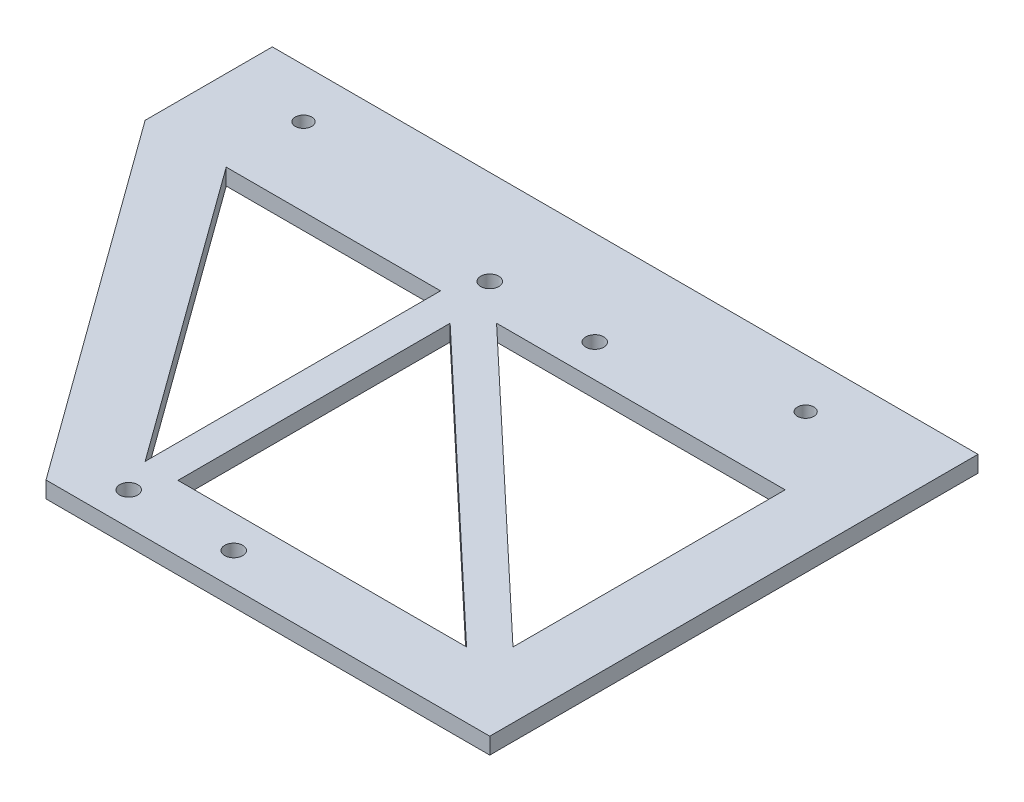
ISO-10303-21;
HEADER;
FILE_DESCRIPTION(('STEP AP214'),'2;1');
FILE_NAME('part.step','',(''),(''),'','','');
FILE_SCHEMA(('AUTOMOTIVE_DESIGN { 1 0 10303 214 1 1 1 1 }'));
ENDSEC;
DATA;
#1=APPLICATION_CONTEXT('core data for automotive mechanical design processes');
#2=APPLICATION_PROTOCOL_DEFINITION('international standard','automotive_design',2000,#1);
#3=PRODUCT_CONTEXT('',#1,'mechanical');
#4=PRODUCT('Part','Part','',(#3));
#5=PRODUCT_RELATED_PRODUCT_CATEGORY('part','',(#4));
#6=PRODUCT_DEFINITION_FORMATION('','',#4);
#7=PRODUCT_DEFINITION_CONTEXT('part definition',#1,'design');
#8=PRODUCT_DEFINITION('design','',#6,#7);
#9=PRODUCT_DEFINITION_SHAPE('','',#8);
#10=(LENGTH_UNIT() NAMED_UNIT(*) SI_UNIT(.MILLI.,.METRE.));
#11=(NAMED_UNIT(*) PLANE_ANGLE_UNIT() SI_UNIT($,.RADIAN.));
#12=(NAMED_UNIT(*) SI_UNIT($,.STERADIAN.) SOLID_ANGLE_UNIT());
#13=UNCERTAINTY_MEASURE_WITH_UNIT(LENGTH_MEASURE(1.E-05),#10,'distance_accuracy_value','');
#14=(GEOMETRIC_REPRESENTATION_CONTEXT(3) GLOBAL_UNCERTAINTY_ASSIGNED_CONTEXT((#13)) GLOBAL_UNIT_ASSIGNED_CONTEXT((#10,
#11,#12)) REPRESENTATION_CONTEXT('',''));
#15=CARTESIAN_POINT('',(0.,0.,0.));
#16=DIRECTION('',(0.,0.,1.));
#17=DIRECTION('',(1.,0.,0.));
#18=AXIS2_PLACEMENT_3D('',#15,#16,#17);
#19=CARTESIAN_POINT('',(0.,5.,0.));
#20=DIRECTION('',(0.,-1.,0.));
#21=DIRECTION('',(0.,0.,-1.));
#22=AXIS2_PLACEMENT_3D('',#19,#20,#21);
#23=PLANE('',#22);
#24=CARTESIAN_POINT('',(97.6994431142104,5.,-133.75));
#25=DIRECTION('',(0.,1.,0.));
#26=DIRECTION('',(0.,0.,1.));
#27=AXIS2_PLACEMENT_3D('',#24,#25,#26);
#28=CIRCLE('',#27,2.50000000000001);
#29=CARTESIAN_POINT('',(97.6994431142104,5.,-131.25));
#30=VERTEX_POINT('',#29);
#31=EDGE_CURVE('E183',#30,#30,#28,.T.);
#32=ORIENTED_EDGE('',*,*,#31,.F.);
#33=EDGE_LOOP('',(#32));
#34=FACE_BOUND('',#33,.T.);
#35=DIRECTION('',(0.,0.,1.));
#36=VECTOR('',#35,1.);
#37=CARTESIAN_POINT('',(20.1994431142178,5.,-20.));
#38=LINE('',#37,#36);
#39=CARTESIAN_POINT('',(20.1994431142178,5.,-102.925904836341));
#40=VERTEX_POINT('',#39);
#41=CARTESIAN_POINT('',(20.1994431142178,5.,-20.));
#42=VERTEX_POINT('',#41);
#43=EDGE_CURVE('E191',#40,#42,#38,.T.);
#44=ORIENTED_EDGE('',*,*,#43,.F.);
#45=DIRECTION('',(-0.727488889904011,0.,-0.686119461221025));
#46=VECTOR('',#45,1.);
#47=CARTESIAN_POINT('',(20.1994431142178,5.,-102.925904836341));
#48=LINE('',#47,#46);
#49=CARTESIAN_POINT('',(108.12534795055,5.,-20.));
#50=VERTEX_POINT('',#49);
#51=EDGE_CURVE('E199',#50,#40,#48,.T.);
#52=ORIENTED_EDGE('',*,*,#51,.F.);
#53=DIRECTION('',(1.,0.,0.));
#54=VECTOR('',#53,1.);
#55=CARTESIAN_POINT('',(108.12534795055,5.,-20.));
#56=LINE('',#55,#54);
#57=EDGE_CURVE('E194',#42,#50,#56,.T.);
#58=ORIENTED_EDGE('',*,*,#57,.F.);
#59=EDGE_LOOP('',(#44,#52,#58));
#60=FACE_BOUND('',#59,.T.);
#61=CARTESIAN_POINT('',(47.1994431142081,5.,-120.));
#62=DIRECTION('',(0.,1.,0.));
#63=DIRECTION('',(0.,0.,1.));
#64=AXIS2_PLACEMENT_3D('',#61,#62,#63);
#65=CIRCLE('',#64,2.75000000000001);
#66=CARTESIAN_POINT('',(47.1994431142081,5.,-117.25));
#67=VERTEX_POINT('',#66);
#68=EDGE_CURVE('E257',#67,#67,#65,.T.);
#69=ORIENTED_EDGE('',*,*,#68,.F.);
#70=EDGE_LOOP('',(#69));
#71=FACE_BOUND('',#70,.T.);
#72=CARTESIAN_POINT('',(15.1994431142081,5.,-120.));
#73=DIRECTION('',(0.,1.,0.));
#74=DIRECTION('',(0.,0.,1.));
#75=AXIS2_PLACEMENT_3D('',#72,#73,#74);
#76=CIRCLE('',#75,2.75);
#77=CARTESIAN_POINT('',(15.1994431142081,5.,-117.25));
#78=VERTEX_POINT('',#77);
#79=EDGE_CURVE('E265',#78,#78,#76,.T.);
#80=ORIENTED_EDGE('',*,*,#79,.F.);
#81=EDGE_LOOP('',(#80));
#82=FACE_BOUND('',#81,.T.);
#83=CARTESIAN_POINT('',(47.199443114208,5.,-10.));
#84=DIRECTION('',(0.,1.,0.));
#85=DIRECTION('',(0.,0.,1.));
#86=AXIS2_PLACEMENT_3D('',#83,#84,#85);
#87=CIRCLE('',#86,2.75000000000001);
#88=CARTESIAN_POINT('',(47.199443114208,5.,-7.25000000000003));
#89=VERTEX_POINT('',#88);
#90=EDGE_CURVE('E273',#89,#89,#87,.T.);
#91=ORIENTED_EDGE('',*,*,#90,.F.);
#92=EDGE_LOOP('',(#91));
#93=FACE_BOUND('',#92,.T.);
#94=CARTESIAN_POINT('',(15.199443114208,5.,-10.));
#95=DIRECTION('',(0.,1.,0.));
#96=DIRECTION('',(0.,0.,1.));
#97=AXIS2_PLACEMENT_3D('',#94,#95,#96);
#98=CIRCLE('',#97,2.75);
#99=CARTESIAN_POINT('',(15.199443114208,5.,-7.25000000000004));
#100=VERTEX_POINT('',#99);
#101=EDGE_CURVE('E281',#100,#100,#98,.T.);
#102=ORIENTED_EDGE('',*,*,#101,.F.);
#103=EDGE_LOOP('',(#102));
#104=FACE_BOUND('',#103,.T.);
#105=CARTESIAN_POINT('',(-55.3005568857919,5.,-133.75));
#106=DIRECTION('',(0.,1.,0.));
#107=DIRECTION('',(0.,0.,1.));
#108=AXIS2_PLACEMENT_3D('',#105,#106,#107);
#109=CIRCLE('',#108,2.50000000000004);
#110=CARTESIAN_POINT('',(-55.3005568857919,5.,-131.25));
#111=VERTEX_POINT('',#110);
#112=EDGE_CURVE('E289',#111,#111,#109,.T.);
#113=ORIENTED_EDGE('',*,*,#112,.F.);
#114=EDGE_LOOP('',(#113));
#115=FACE_BOUND('',#114,.T.);
#116=DIRECTION('',(0.58721139388764,0.,0.809433616109768));
#117=VECTOR('',#116,1.);
#118=CARTESIAN_POINT('',(-79.8005568857919,5.,-109.999999999999));
#119=LINE('',#118,#117);
#120=CARTESIAN_POINT('',(-79.8005568857919,5.,-109.999999999999));
#121=VERTEX_POINT('',#120);
#122=CARTESIAN_POINT('',(0.,5.,0.));
#123=VERTEX_POINT('',#122);
#124=EDGE_CURVE('E297',#121,#123,#119,.T.);
#125=ORIENTED_EDGE('',*,*,#124,.T.);
#126=DIRECTION('',(1.,0.,0.));
#127=VECTOR('',#126,1.);
#128=CARTESIAN_POINT('',(135.199443114208,5.,0.));
#129=LINE('',#128,#127);
#130=CARTESIAN_POINT('',(135.199443114208,5.,0.));
#131=VERTEX_POINT('',#130);
#132=EDGE_CURVE('E301',#123,#131,#129,.T.);
#133=ORIENTED_EDGE('',*,*,#132,.T.);
#134=DIRECTION('',(0.,0.,-1.));
#135=VECTOR('',#134,1.);
#136=CARTESIAN_POINT('',(135.199443114208,5.,0.));
#137=LINE('',#136,#135);
#138=CARTESIAN_POINT('',(135.199443114208,5.,-148.75));
#139=VERTEX_POINT('',#138);
#140=EDGE_CURVE('E305',#131,#139,#137,.T.);
#141=ORIENTED_EDGE('',*,*,#140,.T.);
#142=DIRECTION('',(-1.,0.,0.));
#143=VECTOR('',#142,1.);
#144=CARTESIAN_POINT('',(-79.8005568857919,5.,-148.75));
#145=LINE('',#144,#143);
#146=CARTESIAN_POINT('',(-79.8005568857919,5.,-148.75));
#147=VERTEX_POINT('',#146);
#148=EDGE_CURVE('E308',#139,#147,#145,.T.);
#149=ORIENTED_EDGE('',*,*,#148,.T.);
#150=DIRECTION('',(0.,0.,1.));
#151=VECTOR('',#150,1.);
#152=CARTESIAN_POINT('',(-79.8005568857919,5.,-109.999999999999));
#153=LINE('',#152,#151);
#154=EDGE_CURVE('E311',#147,#121,#153,.T.);
#155=ORIENTED_EDGE('',*,*,#154,.T.);
#156=EDGE_LOOP('',(#125,#133,#141,#149,#155));
#157=FACE_BOUND('',#156,.T.);
#158=DIRECTION('',(0.,0.,-1.));
#159=VECTOR('',#158,1.);
#160=CARTESIAN_POINT('',(115.199443114208,5.,-109.999999999999));
#161=LINE('',#160,#159);
#162=CARTESIAN_POINT('',(115.199443114208,5.,-27.0740951636579));
#163=VERTEX_POINT('',#162);
#164=CARTESIAN_POINT('',(115.199443114208,5.,-109.999999999999));
#165=VERTEX_POINT('',#164);
#166=EDGE_CURVE('E224',#163,#165,#161,.T.);
#167=ORIENTED_EDGE('',*,*,#166,.F.);
#168=DIRECTION('',(0.727488889904011,0.,0.686119461221025));
#169=VECTOR('',#168,1.);
#170=CARTESIAN_POINT('',(27.2735382778757,5.,-109.999999999999));
#171=LINE('',#170,#169);
#172=CARTESIAN_POINT('',(27.2735382778757,5.,-109.999999999999));
#173=VERTEX_POINT('',#172);
#174=EDGE_CURVE('E232',#173,#163,#171,.T.);
#175=ORIENTED_EDGE('',*,*,#174,.F.);
#176=DIRECTION('',(-1.,0.,0.));
#177=VECTOR('',#176,1.);
#178=CARTESIAN_POINT('',(27.2735382778757,5.,-109.999999999999));
#179=LINE('',#178,#177);
#180=EDGE_CURVE('E227',#165,#173,#179,.T.);
#181=ORIENTED_EDGE('',*,*,#180,.F.);
#182=EDGE_LOOP('',(#167,#175,#181));
#183=FACE_BOUND('',#182,.T.);
#184=DIRECTION('',(-1.,0.,0.));
#185=VECTOR('',#184,1.);
#186=CARTESIAN_POINT('',(-55.0919216105209,5.,-109.999999999999));
#187=LINE('',#186,#185);
#188=CARTESIAN_POINT('',(10.1994431142178,5.,-109.999999999999));
#189=VERTEX_POINT('',#188);
#190=CARTESIAN_POINT('',(-55.0919216105209,5.,-109.999999999999));
#191=VERTEX_POINT('',#190);
#192=EDGE_CURVE('E147',#189,#191,#187,.T.);
#193=ORIENTED_EDGE('',*,*,#192,.F.);
#194=DIRECTION('',(0.,0.,-1.));
#195=VECTOR('',#194,1.);
#196=CARTESIAN_POINT('',(10.1994431142178,5.,-109.999999999999));
#197=LINE('',#196,#195);
#198=CARTESIAN_POINT('',(10.1994431142178,5.,-20.));
#199=VERTEX_POINT('',#198);
#200=EDGE_CURVE('E166',#199,#189,#197,.T.);
#201=ORIENTED_EDGE('',*,*,#200,.F.);
#202=DIRECTION('',(0.58721139388764,0.,0.809433616109768));
#203=VECTOR('',#202,1.);
#204=CARTESIAN_POINT('',(-55.0919216105209,5.,-109.999999999999));
#205=LINE('',#204,#203);
#206=EDGE_CURVE('E156',#191,#199,#205,.T.);
#207=ORIENTED_EDGE('',*,*,#206,.F.);
#208=EDGE_LOOP('',(#193,#201,#207));
#209=FACE_BOUND('',#208,.T.);
#210=ADVANCED_FACE('F45',(#34,#60,#71,#82,#93,#104,#115,#157,#183,#209),#23,.F.);
#211=CARTESIAN_POINT('',(0.,0.,0.));
#212=DIRECTION('',(0.,-1.,0.));
#213=DIRECTION('',(0.,0.,-1.));
#214=AXIS2_PLACEMENT_3D('',#211,#212,#213);
#215=PLANE('',#214);
#216=DIRECTION('',(-0.727488889904011,0.,-0.686119461221025));
#217=VECTOR('',#216,1.);
#218=CARTESIAN_POINT('',(20.1994431142178,0.,-102.925904836341));
#219=LINE('',#218,#217);
#220=CARTESIAN_POINT('',(108.12534795055,0.,-20.));
#221=VERTEX_POINT('',#220);
#222=CARTESIAN_POINT('',(20.1994431142178,0.,-102.925904836341));
#223=VERTEX_POINT('',#222);
#224=EDGE_CURVE('E195',#221,#223,#219,.T.);
#225=ORIENTED_EDGE('',*,*,#224,.T.);
#226=DIRECTION('',(0.,0.,1.));
#227=VECTOR('',#226,1.);
#228=CARTESIAN_POINT('',(20.1994431142178,0.,-20.));
#229=LINE('',#228,#227);
#230=CARTESIAN_POINT('',(20.1994431142178,0.,-20.));
#231=VERTEX_POINT('',#230);
#232=EDGE_CURVE('E187',#223,#231,#229,.T.);
#233=ORIENTED_EDGE('',*,*,#232,.T.);
#234=DIRECTION('',(1.,0.,0.));
#235=VECTOR('',#234,1.);
#236=CARTESIAN_POINT('',(108.12534795055,0.,-20.));
#237=LINE('',#236,#235);
#238=EDGE_CURVE('E206',#231,#221,#237,.T.);
#239=ORIENTED_EDGE('',*,*,#238,.T.);
#240=EDGE_LOOP('',(#225,#233,#239));
#241=FACE_BOUND('',#240,.T.);
#242=DIRECTION('',(0.727488889904011,0.,0.686119461221025));
#243=VECTOR('',#242,1.);
#244=CARTESIAN_POINT('',(27.2735382778757,0.,-109.999999999999));
#245=LINE('',#244,#243);
#246=CARTESIAN_POINT('',(27.2735382778757,0.,-109.999999999999));
#247=VERTEX_POINT('',#246);
#248=CARTESIAN_POINT('',(115.199443114208,0.,-27.0740951636579));
#249=VERTEX_POINT('',#248);
#250=EDGE_CURVE('E228',#247,#249,#245,.T.);
#251=ORIENTED_EDGE('',*,*,#250,.T.);
#252=DIRECTION('',(0.,0.,-1.));
#253=VECTOR('',#252,1.);
#254=CARTESIAN_POINT('',(115.199443114208,0.,-109.999999999999));
#255=LINE('',#254,#253);
#256=CARTESIAN_POINT('',(115.199443114208,0.,-109.999999999999));
#257=VERTEX_POINT('',#256);
#258=EDGE_CURVE('E223',#249,#257,#255,.T.);
#259=ORIENTED_EDGE('',*,*,#258,.T.);
#260=DIRECTION('',(-1.,0.,0.));
#261=VECTOR('',#260,1.);
#262=CARTESIAN_POINT('',(27.2735382778757,0.,-109.999999999999));
#263=LINE('',#262,#261);
#264=EDGE_CURVE('E239',#257,#247,#263,.T.);
#265=ORIENTED_EDGE('',*,*,#264,.T.);
#266=EDGE_LOOP('',(#251,#259,#265));
#267=FACE_BOUND('',#266,.T.);
#268=CARTESIAN_POINT('',(47.1994431142081,0.,-120.));
#269=DIRECTION('',(0.,1.,0.));
#270=DIRECTION('',(0.,0.,1.));
#271=AXIS2_PLACEMENT_3D('',#268,#269,#270);
#272=CIRCLE('',#271,2.75000000000001);
#273=CARTESIAN_POINT('',(47.1994431142081,0.,-117.25));
#274=VERTEX_POINT('',#273);
#275=EDGE_CURVE('E256',#274,#274,#272,.T.);
#276=ORIENTED_EDGE('',*,*,#275,.T.);
#277=EDGE_LOOP('',(#276));
#278=FACE_BOUND('',#277,.T.);
#279=CARTESIAN_POINT('',(47.199443114208,0.,-10.));
#280=DIRECTION('',(0.,1.,0.));
#281=DIRECTION('',(0.,0.,1.));
#282=AXIS2_PLACEMENT_3D('',#279,#280,#281);
#283=CIRCLE('',#282,2.75000000000001);
#284=CARTESIAN_POINT('',(47.199443114208,0.,-7.25000000000003));
#285=VERTEX_POINT('',#284);
#286=EDGE_CURVE('E269',#285,#285,#283,.T.);
#287=ORIENTED_EDGE('',*,*,#286,.T.);
#288=EDGE_LOOP('',(#287));
#289=FACE_BOUND('',#288,.T.);
#290=CARTESIAN_POINT('',(-55.3005568857919,0.,-133.75));
#291=DIRECTION('',(0.,1.,0.));
#292=DIRECTION('',(0.,0.,1.));
#293=AXIS2_PLACEMENT_3D('',#290,#291,#292);
#294=CIRCLE('',#293,2.50000000000004);
#295=CARTESIAN_POINT('',(-55.3005568857919,0.,-131.25));
#296=VERTEX_POINT('',#295);
#297=EDGE_CURVE('E285',#296,#296,#294,.T.);
#298=ORIENTED_EDGE('',*,*,#297,.T.);
#299=EDGE_LOOP('',(#298));
#300=FACE_BOUND('',#299,.T.);
#301=DIRECTION('',(0.58721139388764,0.,0.809433616109768));
#302=VECTOR('',#301,1.);
#303=CARTESIAN_POINT('',(-79.8005568857919,0.,-109.999999999999));
#304=LINE('',#303,#302);
#305=CARTESIAN_POINT('',(-79.8005568857919,0.,-109.999999999999));
#306=VERTEX_POINT('',#305);
#307=CARTESIAN_POINT('',(0.,0.,0.));
#308=VERTEX_POINT('',#307);
#309=EDGE_CURVE('E293',#306,#308,#304,.T.);
#310=ORIENTED_EDGE('',*,*,#309,.F.);
#311=DIRECTION('',(0.,0.,1.));
#312=VECTOR('',#311,1.);
#313=CARTESIAN_POINT('',(-79.8005568857919,0.,-109.999999999999));
#314=LINE('',#313,#312);
#315=CARTESIAN_POINT('',(-79.8005568857919,0.,-148.75));
#316=VERTEX_POINT('',#315);
#317=EDGE_CURVE('E302',#316,#306,#314,.T.);
#318=ORIENTED_EDGE('',*,*,#317,.F.);
#319=DIRECTION('',(-1.,0.,0.));
#320=VECTOR('',#319,1.);
#321=CARTESIAN_POINT('',(-79.8005568857919,0.,-148.75));
#322=LINE('',#321,#320);
#323=CARTESIAN_POINT('',(135.199443114208,0.,-148.75));
#324=VERTEX_POINT('',#323);
#325=EDGE_CURVE('E324',#324,#316,#322,.T.);
#326=ORIENTED_EDGE('',*,*,#325,.F.);
#327=DIRECTION('',(0.,0.,-1.));
#328=VECTOR('',#327,1.);
#329=CARTESIAN_POINT('',(135.199443114208,0.,0.));
#330=LINE('',#329,#328);
#331=CARTESIAN_POINT('',(135.199443114208,0.,0.));
#332=VERTEX_POINT('',#331);
#333=EDGE_CURVE('E321',#332,#324,#330,.T.);
#334=ORIENTED_EDGE('',*,*,#333,.F.);
#335=DIRECTION('',(1.,0.,0.));
#336=VECTOR('',#335,1.);
#337=CARTESIAN_POINT('',(135.199443114208,0.,0.));
#338=LINE('',#337,#336);
#339=EDGE_CURVE('E318',#308,#332,#338,.T.);
#340=ORIENTED_EDGE('',*,*,#339,.F.);
#341=EDGE_LOOP('',(#310,#318,#326,#334,#340));
#342=FACE_BOUND('',#341,.T.);
#343=CARTESIAN_POINT('',(15.199443114208,0.,-10.));
#344=DIRECTION('',(0.,1.,0.));
#345=DIRECTION('',(0.,0.,1.));
#346=AXIS2_PLACEMENT_3D('',#343,#344,#345);
#347=CIRCLE('',#346,2.75);
#348=CARTESIAN_POINT('',(15.199443114208,0.,-7.25000000000004));
#349=VERTEX_POINT('',#348);
#350=EDGE_CURVE('E277',#349,#349,#347,.T.);
#351=ORIENTED_EDGE('',*,*,#350,.T.);
#352=EDGE_LOOP('',(#351));
#353=FACE_BOUND('',#352,.T.);
#354=CARTESIAN_POINT('',(15.1994431142081,0.,-120.));
#355=DIRECTION('',(0.,1.,0.));
#356=DIRECTION('',(0.,0.,1.));
#357=AXIS2_PLACEMENT_3D('',#354,#355,#356);
#358=CIRCLE('',#357,2.75);
#359=CARTESIAN_POINT('',(15.1994431142081,0.,-117.25));
#360=VERTEX_POINT('',#359);
#361=EDGE_CURVE('E261',#360,#360,#358,.T.);
#362=ORIENTED_EDGE('',*,*,#361,.T.);
#363=EDGE_LOOP('',(#362));
#364=FACE_BOUND('',#363,.T.);
#365=CARTESIAN_POINT('',(97.6994431142104,0.,-133.75));
#366=DIRECTION('',(0.,1.,0.));
#367=DIRECTION('',(0.,0.,1.));
#368=AXIS2_PLACEMENT_3D('',#365,#366,#367);
#369=CIRCLE('',#368,2.50000000000001);
#370=CARTESIAN_POINT('',(97.6994431142104,0.,-131.25));
#371=VERTEX_POINT('',#370);
#372=EDGE_CURVE('E164',#371,#371,#369,.T.);
#373=ORIENTED_EDGE('',*,*,#372,.T.);
#374=EDGE_LOOP('',(#373));
#375=FACE_BOUND('',#374,.T.);
#376=DIRECTION('',(0.,0.,-1.));
#377=VECTOR('',#376,1.);
#378=CARTESIAN_POINT('',(10.1994431142178,0.,-109.999999999999));
#379=LINE('',#378,#377);
#380=CARTESIAN_POINT('',(10.1994431142178,0.,-20.));
#381=VERTEX_POINT('',#380);
#382=CARTESIAN_POINT('',(10.1994431142178,0.,-109.999999999999));
#383=VERTEX_POINT('',#382);
#384=EDGE_CURVE('E157',#381,#383,#379,.T.);
#385=ORIENTED_EDGE('',*,*,#384,.T.);
#386=DIRECTION('',(-1.,0.,0.));
#387=VECTOR('',#386,1.);
#388=CARTESIAN_POINT('',(-55.0919216105209,0.,-109.999999999999));
#389=LINE('',#388,#387);
#390=CARTESIAN_POINT('',(-55.0919216105209,0.,-109.999999999999));
#391=VERTEX_POINT('',#390);
#392=EDGE_CURVE('E69',#383,#391,#389,.T.);
#393=ORIENTED_EDGE('',*,*,#392,.T.);
#394=DIRECTION('',(0.58721139388764,0.,0.809433616109768));
#395=VECTOR('',#394,1.);
#396=CARTESIAN_POINT('',(-55.0919216105209,0.,-109.999999999999));
#397=LINE('',#396,#395);
#398=EDGE_CURVE('E162',#391,#381,#397,.T.);
#399=ORIENTED_EDGE('',*,*,#398,.T.);
#400=EDGE_LOOP('',(#385,#393,#399));
#401=FACE_BOUND('',#400,.T.);
#402=ADVANCED_FACE('F351',(#241,#267,#278,#289,#300,#342,#353,#364,#375,#401),#215,.T.);
#403=CARTESIAN_POINT('',(-79.8005568857919,5.,-109.999999999999));
#404=DIRECTION('',(0.809433616109768,0.,-0.58721139388764));
#405=DIRECTION('',(-0.58721139388764,0.,-0.809433616109768));
#406=AXIS2_PLACEMENT_3D('',#403,#404,#405);
#407=PLANE('',#406);
#408=ORIENTED_EDGE('',*,*,#309,.T.);
#409=DIRECTION('',(0.,-1.,0.));
#410=VECTOR('',#409,1.);
#411=CARTESIAN_POINT('',(0.,5.,0.));
#412=LINE('',#411,#410);
#413=EDGE_CURVE('E11',#123,#308,#412,.T.);
#414=ORIENTED_EDGE('',*,*,#413,.F.);
#415=ORIENTED_EDGE('',*,*,#124,.F.);
#416=DIRECTION('',(0.,-1.,0.));
#417=VECTOR('',#416,1.);
#418=CARTESIAN_POINT('',(-79.8005568857919,5.,-109.999999999999));
#419=LINE('',#418,#417);
#420=EDGE_CURVE('E314',#121,#306,#419,.T.);
#421=ORIENTED_EDGE('',*,*,#420,.T.);
#422=EDGE_LOOP('',(#408,#414,#415,#421));
#423=FACE_BOUND('',#422,.T.);
#424=ADVANCED_FACE('F47',(#423),#407,.F.);
#425=CARTESIAN_POINT('',(135.199443114208,5.,0.));
#426=DIRECTION('',(0.,0.,-1.));
#427=DIRECTION('',(-1.,0.,0.));
#428=AXIS2_PLACEMENT_3D('',#425,#426,#427);
#429=PLANE('',#428);
#430=ORIENTED_EDGE('',*,*,#339,.T.);
#431=DIRECTION('',(0.,-1.,0.));
#432=VECTOR('',#431,1.);
#433=CARTESIAN_POINT('',(135.199443114208,5.,0.));
#434=LINE('',#433,#432);
#435=EDGE_CURVE('E54',#131,#332,#434,.T.);
#436=ORIENTED_EDGE('',*,*,#435,.F.);
#437=ORIENTED_EDGE('',*,*,#132,.F.);
#438=ORIENTED_EDGE('',*,*,#413,.T.);
#439=EDGE_LOOP('',(#430,#436,#437,#438));
#440=FACE_BOUND('',#439,.T.);
#441=ADVANCED_FACE('F366',(#440),#429,.F.);
#442=CARTESIAN_POINT('',(135.199443114208,5.,0.));
#443=DIRECTION('',(-1.,0.,0.));
#444=DIRECTION('',(0.,0.,1.));
#445=AXIS2_PLACEMENT_3D('',#442,#443,#444);
#446=PLANE('',#445);
#447=ORIENTED_EDGE('',*,*,#333,.T.);
#448=DIRECTION('',(0.,-1.,0.));
#449=VECTOR('',#448,1.);
#450=CARTESIAN_POINT('',(135.199443114208,5.,-148.75));
#451=LINE('',#450,#449);
#452=EDGE_CURVE('E336',#139,#324,#451,.T.);
#453=ORIENTED_EDGE('',*,*,#452,.F.);
#454=ORIENTED_EDGE('',*,*,#140,.F.);
#455=ORIENTED_EDGE('',*,*,#435,.T.);
#456=EDGE_LOOP('',(#447,#453,#454,#455));
#457=FACE_BOUND('',#456,.T.);
#458=ADVANCED_FACE('F345',(#457),#446,.F.);
#459=CARTESIAN_POINT('',(-79.8005568857919,5.,-148.75));
#460=DIRECTION('',(0.,0.,1.));
#461=DIRECTION('',(1.,0.,0.));
#462=AXIS2_PLACEMENT_3D('',#459,#460,#461);
#463=PLANE('',#462);
#464=ORIENTED_EDGE('',*,*,#325,.T.);
#465=DIRECTION('',(0.,-1.,0.));
#466=VECTOR('',#465,1.);
#467=CARTESIAN_POINT('',(-79.8005568857919,5.,-148.75));
#468=LINE('',#467,#466);
#469=EDGE_CURVE('E332',#147,#316,#468,.T.);
#470=ORIENTED_EDGE('',*,*,#469,.F.);
#471=ORIENTED_EDGE('',*,*,#148,.F.);
#472=ORIENTED_EDGE('',*,*,#452,.T.);
#473=EDGE_LOOP('',(#464,#470,#471,#472));
#474=FACE_BOUND('',#473,.T.);
#475=ADVANCED_FACE('F356',(#474),#463,.F.);
#476=CARTESIAN_POINT('',(-79.8005568857919,5.,-109.999999999999));
#477=DIRECTION('',(1.,0.,0.));
#478=DIRECTION('',(0.,0.,-1.));
#479=AXIS2_PLACEMENT_3D('',#476,#477,#478);
#480=PLANE('',#479);
#481=ORIENTED_EDGE('',*,*,#317,.T.);
#482=ORIENTED_EDGE('',*,*,#420,.F.);
#483=ORIENTED_EDGE('',*,*,#154,.F.);
#484=ORIENTED_EDGE('',*,*,#469,.T.);
#485=EDGE_LOOP('',(#481,#482,#483,#484));
#486=FACE_BOUND('',#485,.T.);
#487=ADVANCED_FACE('F360',(#486),#480,.F.);
#488=CARTESIAN_POINT('',(-55.3005568857919,5.,-133.75));
#489=DIRECTION('',(0.,-1.,0.));
#490=DIRECTION('',(0.,0.,-1.));
#491=AXIS2_PLACEMENT_3D('',#488,#489,#490);
#492=CYLINDRICAL_SURFACE('',#491,2.50000000000004);
#493=ORIENTED_EDGE('',*,*,#112,.T.);
#494=EDGE_LOOP('',(#493));
#495=FACE_BOUND('',#494,.T.);
#496=ORIENTED_EDGE('',*,*,#297,.F.);
#497=EDGE_LOOP('',(#496));
#498=FACE_BOUND('',#497,.T.);
#499=ADVANCED_FACE('F383',(#495,#498),#492,.F.);
#500=CARTESIAN_POINT('',(15.199443114208,5.,-10.));
#501=DIRECTION('',(0.,-1.,0.));
#502=DIRECTION('',(0.,0.,-1.));
#503=AXIS2_PLACEMENT_3D('',#500,#501,#502);
#504=CYLINDRICAL_SURFACE('',#503,2.75);
#505=ORIENTED_EDGE('',*,*,#101,.T.);
#506=EDGE_LOOP('',(#505));
#507=FACE_BOUND('',#506,.T.);
#508=ORIENTED_EDGE('',*,*,#350,.F.);
#509=EDGE_LOOP('',(#508));
#510=FACE_BOUND('',#509,.T.);
#511=ADVANCED_FACE('F412',(#507,#510),#504,.F.);
#512=CARTESIAN_POINT('',(47.199443114208,5.,-10.));
#513=DIRECTION('',(0.,-1.,0.));
#514=DIRECTION('',(0.,0.,-1.));
#515=AXIS2_PLACEMENT_3D('',#512,#513,#514);
#516=CYLINDRICAL_SURFACE('',#515,2.75000000000001);
#517=ORIENTED_EDGE('',*,*,#90,.T.);
#518=EDGE_LOOP('',(#517));
#519=FACE_BOUND('',#518,.T.);
#520=ORIENTED_EDGE('',*,*,#286,.F.);
#521=EDGE_LOOP('',(#520));
#522=FACE_BOUND('',#521,.T.);
#523=ADVANCED_FACE('F420',(#519,#522),#516,.F.);
#524=CARTESIAN_POINT('',(15.1994431142081,5.,-120.));
#525=DIRECTION('',(0.,-1.,0.));
#526=DIRECTION('',(0.,0.,-1.));
#527=AXIS2_PLACEMENT_3D('',#524,#525,#526);
#528=CYLINDRICAL_SURFACE('',#527,2.75);
#529=ORIENTED_EDGE('',*,*,#79,.T.);
#530=EDGE_LOOP('',(#529));
#531=FACE_BOUND('',#530,.T.);
#532=ORIENTED_EDGE('',*,*,#361,.F.);
#533=EDGE_LOOP('',(#532));
#534=FACE_BOUND('',#533,.T.);
#535=ADVANCED_FACE('F428',(#531,#534),#528,.F.);
#536=CARTESIAN_POINT('',(47.1994431142081,5.,-120.));
#537=DIRECTION('',(0.,-1.,0.));
#538=DIRECTION('',(0.,0.,-1.));
#539=AXIS2_PLACEMENT_3D('',#536,#537,#538);
#540=CYLINDRICAL_SURFACE('',#539,2.75000000000001);
#541=ORIENTED_EDGE('',*,*,#68,.T.);
#542=EDGE_LOOP('',(#541));
#543=FACE_BOUND('',#542,.T.);
#544=ORIENTED_EDGE('',*,*,#275,.F.);
#545=EDGE_LOOP('',(#544));
#546=FACE_BOUND('',#545,.T.);
#547=ADVANCED_FACE('F437',(#543,#546),#540,.F.);
#548=CARTESIAN_POINT('',(115.199443114208,5.,-109.999999999999));
#549=DIRECTION('',(-1.,0.,0.));
#550=DIRECTION('',(0.,0.,1.));
#551=AXIS2_PLACEMENT_3D('',#548,#549,#550);
#552=PLANE('',#551);
#553=ORIENTED_EDGE('',*,*,#258,.F.);
#554=DIRECTION('',(0.,-1.,0.));
#555=VECTOR('',#554,1.);
#556=CARTESIAN_POINT('',(115.199443114208,5.,-27.0740951636579));
#557=LINE('',#556,#555);
#558=EDGE_CURVE('E235',#163,#249,#557,.T.);
#559=ORIENTED_EDGE('',*,*,#558,.F.);
#560=ORIENTED_EDGE('',*,*,#166,.T.);
#561=DIRECTION('',(0.,-1.,0.));
#562=VECTOR('',#561,1.);
#563=CARTESIAN_POINT('',(115.199443114208,5.,-109.999999999999));
#564=LINE('',#563,#562);
#565=EDGE_CURVE('E252',#165,#257,#564,.T.);
#566=ORIENTED_EDGE('',*,*,#565,.T.);
#567=EDGE_LOOP('',(#553,#559,#560,#566));
#568=FACE_BOUND('',#567,.T.);
#569=ADVANCED_FACE('F446',(#568),#552,.T.);
#570=CARTESIAN_POINT('',(27.2735382778757,5.,-109.999999999999));
#571=DIRECTION('',(0.,0.,1.));
#572=DIRECTION('',(1.,0.,0.));
#573=AXIS2_PLACEMENT_3D('',#570,#571,#572);
#574=PLANE('',#573);
#575=ORIENTED_EDGE('',*,*,#264,.F.);
#576=ORIENTED_EDGE('',*,*,#565,.F.);
#577=ORIENTED_EDGE('',*,*,#180,.T.);
#578=DIRECTION('',(0.,-1.,0.));
#579=VECTOR('',#578,1.);
#580=CARTESIAN_POINT('',(27.2735382778757,5.,-109.999999999999));
#581=LINE('',#580,#579);
#582=EDGE_CURVE('E249',#173,#247,#581,.T.);
#583=ORIENTED_EDGE('',*,*,#582,.T.);
#584=EDGE_LOOP('',(#575,#576,#577,#583));
#585=FACE_BOUND('',#584,.T.);
#586=ADVANCED_FACE('F455',(#585),#574,.T.);
#587=CARTESIAN_POINT('',(27.2735382778757,5.,-109.999999999999));
#588=DIRECTION('',(0.686119461221025,0.,-0.727488889904011));
#589=DIRECTION('',(-0.727488889904011,0.,-0.686119461221025));
#590=AXIS2_PLACEMENT_3D('',#587,#588,#589);
#591=PLANE('',#590);
#592=ORIENTED_EDGE('',*,*,#250,.F.);
#593=ORIENTED_EDGE('',*,*,#582,.F.);
#594=ORIENTED_EDGE('',*,*,#174,.T.);
#595=ORIENTED_EDGE('',*,*,#558,.T.);
#596=EDGE_LOOP('',(#592,#593,#594,#595));
#597=FACE_BOUND('',#596,.T.);
#598=ADVANCED_FACE('F464',(#597),#591,.T.);
#599=CARTESIAN_POINT('',(20.1994431142178,5.,-20.));
#600=DIRECTION('',(1.,0.,0.));
#601=DIRECTION('',(0.,0.,-1.));
#602=AXIS2_PLACEMENT_3D('',#599,#600,#601);
#603=PLANE('',#602);
#604=ORIENTED_EDGE('',*,*,#232,.F.);
#605=DIRECTION('',(0.,-1.,0.));
#606=VECTOR('',#605,1.);
#607=CARTESIAN_POINT('',(20.1994431142178,5.,-102.925904836341));
#608=LINE('',#607,#606);
#609=EDGE_CURVE('E202',#40,#223,#608,.T.);
#610=ORIENTED_EDGE('',*,*,#609,.F.);
#611=ORIENTED_EDGE('',*,*,#43,.T.);
#612=DIRECTION('',(0.,-1.,0.));
#613=VECTOR('',#612,1.);
#614=CARTESIAN_POINT('',(20.1994431142178,5.,-20.));
#615=LINE('',#614,#613);
#616=EDGE_CURVE('E219',#42,#231,#615,.T.);
#617=ORIENTED_EDGE('',*,*,#616,.T.);
#618=EDGE_LOOP('',(#604,#610,#611,#617));
#619=FACE_BOUND('',#618,.T.);
#620=ADVANCED_FACE('F473',(#619),#603,.T.);
#621=CARTESIAN_POINT('',(108.12534795055,5.,-20.));
#622=DIRECTION('',(0.,0.,-1.));
#623=DIRECTION('',(-1.,0.,0.));
#624=AXIS2_PLACEMENT_3D('',#621,#622,#623);
#625=PLANE('',#624);
#626=ORIENTED_EDGE('',*,*,#238,.F.);
#627=ORIENTED_EDGE('',*,*,#616,.F.);
#628=ORIENTED_EDGE('',*,*,#57,.T.);
#629=DIRECTION('',(0.,-1.,0.));
#630=VECTOR('',#629,1.);
#631=CARTESIAN_POINT('',(108.12534795055,5.,-20.));
#632=LINE('',#631,#630);
#633=EDGE_CURVE('E216',#50,#221,#632,.T.);
#634=ORIENTED_EDGE('',*,*,#633,.T.);
#635=EDGE_LOOP('',(#626,#627,#628,#634));
#636=FACE_BOUND('',#635,.T.);
#637=ADVANCED_FACE('F482',(#636),#625,.T.);
#638=CARTESIAN_POINT('',(20.1994431142178,5.,-102.925904836341));
#639=DIRECTION('',(-0.686119461221025,0.,0.727488889904011));
#640=DIRECTION('',(0.727488889904011,0.,0.686119461221025));
#641=AXIS2_PLACEMENT_3D('',#638,#639,#640);
#642=PLANE('',#641);
#643=ORIENTED_EDGE('',*,*,#224,.F.);
#644=ORIENTED_EDGE('',*,*,#633,.F.);
#645=ORIENTED_EDGE('',*,*,#51,.T.);
#646=ORIENTED_EDGE('',*,*,#609,.T.);
#647=EDGE_LOOP('',(#643,#644,#645,#646));
#648=FACE_BOUND('',#647,.T.);
#649=ADVANCED_FACE('F491',(#648),#642,.T.);
#650=CARTESIAN_POINT('',(97.6994431142104,5.,-133.75));
#651=DIRECTION('',(0.,-1.,0.));
#652=DIRECTION('',(0.,0.,-1.));
#653=AXIS2_PLACEMENT_3D('',#650,#651,#652);
#654=CYLINDRICAL_SURFACE('',#653,2.50000000000001);
#655=ORIENTED_EDGE('',*,*,#31,.T.);
#656=EDGE_LOOP('',(#655));
#657=FACE_BOUND('',#656,.T.);
#658=ORIENTED_EDGE('',*,*,#372,.F.);
#659=EDGE_LOOP('',(#658));
#660=FACE_BOUND('',#659,.T.);
#661=ADVANCED_FACE('F500',(#657,#660),#654,.F.);
#662=CARTESIAN_POINT('',(-55.0919216105209,5.,-109.999999999999));
#663=DIRECTION('',(0.,0.,1.));
#664=DIRECTION('',(1.,0.,0.));
#665=AXIS2_PLACEMENT_3D('',#662,#663,#664);
#666=PLANE('',#665);
#667=ORIENTED_EDGE('',*,*,#392,.F.);
#668=DIRECTION('',(0.,-1.,0.));
#669=VECTOR('',#668,1.);
#670=CARTESIAN_POINT('',(10.1994431142178,5.,-109.999999999999));
#671=LINE('',#670,#669);
#672=EDGE_CURVE('E151',#189,#383,#671,.T.);
#673=ORIENTED_EDGE('',*,*,#672,.F.);
#674=ORIENTED_EDGE('',*,*,#192,.T.);
#675=DIRECTION('',(0.,-1.,0.));
#676=VECTOR('',#675,1.);
#677=CARTESIAN_POINT('',(-55.0919216105209,5.,-109.999999999999));
#678=LINE('',#677,#676);
#679=EDGE_CURVE('E150',#191,#391,#678,.T.);
#680=ORIENTED_EDGE('',*,*,#679,.T.);
#681=EDGE_LOOP('',(#667,#673,#674,#680));
#682=FACE_BOUND('',#681,.T.);
#683=ADVANCED_FACE('F149',(#682),#666,.T.);
#684=CARTESIAN_POINT('',(-55.0919216105209,5.,-109.999999999999));
#685=DIRECTION('',(0.809433616109768,0.,-0.58721139388764));
#686=DIRECTION('',(-0.58721139388764,0.,-0.809433616109768));
#687=AXIS2_PLACEMENT_3D('',#684,#685,#686);
#688=PLANE('',#687);
#689=ORIENTED_EDGE('',*,*,#398,.F.);
#690=ORIENTED_EDGE('',*,*,#679,.F.);
#691=ORIENTED_EDGE('',*,*,#206,.T.);
#692=DIRECTION('',(0.,-1.,0.));
#693=VECTOR('',#692,1.);
#694=CARTESIAN_POINT('',(10.1994431142178,5.,-20.));
#695=LINE('',#694,#693);
#696=EDGE_CURVE('E61',#199,#381,#695,.T.);
#697=ORIENTED_EDGE('',*,*,#696,.T.);
#698=EDGE_LOOP('',(#689,#690,#691,#697));
#699=FACE_BOUND('',#698,.T.);
#700=ADVANCED_FACE('F160',(#699),#688,.T.);
#701=CARTESIAN_POINT('',(10.1994431142178,5.,-109.999999999999));
#702=DIRECTION('',(-1.,0.,0.));
#703=DIRECTION('',(0.,0.,1.));
#704=AXIS2_PLACEMENT_3D('',#701,#702,#703);
#705=PLANE('',#704);
#706=ORIENTED_EDGE('',*,*,#384,.F.);
#707=ORIENTED_EDGE('',*,*,#696,.F.);
#708=ORIENTED_EDGE('',*,*,#200,.T.);
#709=ORIENTED_EDGE('',*,*,#672,.T.);
#710=EDGE_LOOP('',(#706,#707,#708,#709));
#711=FACE_BOUND('',#710,.T.);
#712=ADVANCED_FACE('F524',(#711),#705,.T.);
#713=CLOSED_SHELL('',(#210,#402,#424,#441,#458,#475,#487,#499,#511,#523,#535,#547,#569,#586,
#598,#620,#637,#649,#661,#683,#700,#712));
#714=MANIFOLD_SOLID_BREP('B2',#713);
#715=ADVANCED_BREP_SHAPE_REPRESENTATION('',(#18,#714),#14);
#716=SHAPE_DEFINITION_REPRESENTATION(#9,#715);
ENDSEC;
END-ISO-10303-21;
